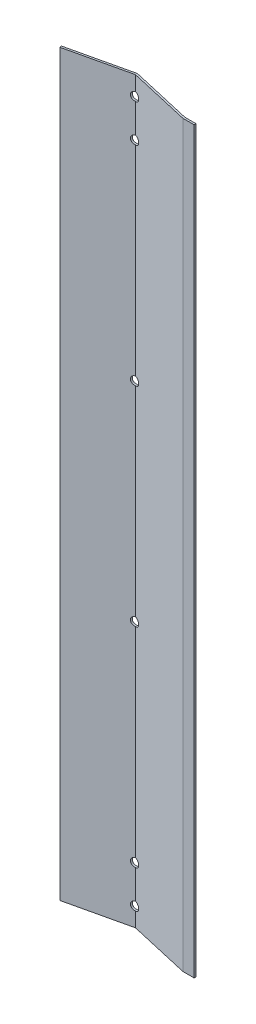
ISO-10303-21;
HEADER;
FILE_DESCRIPTION(('STEP AP214'),'2;1');
FILE_NAME('part.step','',(''),(''),'','','');
FILE_SCHEMA(('AUTOMOTIVE_DESIGN { 1 0 10303 214 1 1 1 1 }'));
ENDSEC;
DATA;
#1=APPLICATION_CONTEXT('core data for automotive mechanical design processes');
#2=APPLICATION_PROTOCOL_DEFINITION('international standard','automotive_design',2000,#1);
#3=PRODUCT_CONTEXT('',#1,'mechanical');
#4=PRODUCT('Part','Part','',(#3));
#5=PRODUCT_RELATED_PRODUCT_CATEGORY('part','',(#4));
#6=PRODUCT_DEFINITION_FORMATION('','',#4);
#7=PRODUCT_DEFINITION_CONTEXT('part definition',#1,'design');
#8=PRODUCT_DEFINITION('design','',#6,#7);
#9=PRODUCT_DEFINITION_SHAPE('','',#8);
#10=(LENGTH_UNIT() NAMED_UNIT(*) SI_UNIT(.MILLI.,.METRE.));
#11=(NAMED_UNIT(*) PLANE_ANGLE_UNIT() SI_UNIT($,.RADIAN.));
#12=(NAMED_UNIT(*) SI_UNIT($,.STERADIAN.) SOLID_ANGLE_UNIT());
#13=UNCERTAINTY_MEASURE_WITH_UNIT(LENGTH_MEASURE(1.E-05),#10,'distance_accuracy_value','');
#14=(GEOMETRIC_REPRESENTATION_CONTEXT(3) GLOBAL_UNCERTAINTY_ASSIGNED_CONTEXT((#13)) GLOBAL_UNIT_ASSIGNED_CONTEXT((#10,
#11,#12)) REPRESENTATION_CONTEXT('',''));
#15=CARTESIAN_POINT('',(0.,0.,0.));
#16=DIRECTION('',(0.,0.,1.));
#17=DIRECTION('',(1.,0.,0.));
#18=AXIS2_PLACEMENT_3D('',#15,#16,#17);
#19=CARTESIAN_POINT('',(-506.627585226793,1960.,994.704780496736));
#20=DIRECTION('',(-1.,0.,0.));
#21=DIRECTION('',(0.,0.,1.));
#22=AXIS2_PLACEMENT_3D('',#19,#20,#21);
#23=PLANE('',#22);
#24=DIRECTION('',(0.,0.,-1.));
#25=VECTOR('',#24,1.);
#26=CARTESIAN_POINT('',(-506.627585226793,0.,994.704780496736));
#27=LINE('',#26,#25);
#28=CARTESIAN_POINT('',(-506.627585226793,0.,999.704780496736));
#29=VERTEX_POINT('',#28);
#30=CARTESIAN_POINT('',(-506.627585226793,0.,994.704780496736));
#31=VERTEX_POINT('',#30);
#32=EDGE_CURVE('E269',#29,#31,#27,.T.);
#33=ORIENTED_EDGE('',*,*,#32,.T.);
#34=DIRECTION('',(0.,-1.,0.));
#35=VECTOR('',#34,1.);
#36=CARTESIAN_POINT('',(-506.627585226793,1960.,994.704780496736));
#37=LINE('',#36,#35);
#38=CARTESIAN_POINT('',(-506.627585226793,1960.,994.704780496736));
#39=VERTEX_POINT('',#38);
#40=EDGE_CURVE('E177',#39,#31,#37,.T.);
#41=ORIENTED_EDGE('',*,*,#40,.F.);
#42=DIRECTION('',(0.,0.,-1.));
#43=VECTOR('',#42,1.);
#44=CARTESIAN_POINT('',(-506.627585226793,1960.,994.704780496736));
#45=LINE('',#44,#43);
#46=CARTESIAN_POINT('',(-506.627585226793,1960.,999.704780496736));
#47=VERTEX_POINT('',#46);
#48=EDGE_CURVE('E270',#47,#39,#45,.T.);
#49=ORIENTED_EDGE('',*,*,#48,.F.);
#50=DIRECTION('',(0.,-1.,0.));
#51=VECTOR('',#50,1.);
#52=CARTESIAN_POINT('',(-506.627585226793,1960.,999.704780496736));
#53=LINE('',#52,#51);
#54=EDGE_CURVE('E288',#47,#29,#53,.T.);
#55=ORIENTED_EDGE('',*,*,#54,.T.);
#56=EDGE_LOOP('',(#33,#41,#49,#55));
#57=FACE_BOUND('',#56,.T.);
#58=ADVANCED_FACE('F33',(#57),#23,.F.);
#59=CARTESIAN_POINT('',(-536.087738825627,1960.,994.704780496736));
#60=DIRECTION('',(0.,0.,1.));
#61=DIRECTION('',(1.,0.,0.));
#62=AXIS2_PLACEMENT_3D('',#59,#60,#61);
#63=PLANE('',#62);
#64=DIRECTION('',(-1.,0.,0.));
#65=VECTOR('',#64,1.);
#66=CARTESIAN_POINT('',(-536.087738825627,0.,994.704780496736));
#67=LINE('',#66,#65);
#68=CARTESIAN_POINT('',(-536.087738825627,0.,994.704780496736));
#69=VERTEX_POINT('',#68);
#70=EDGE_CURVE('E291',#31,#69,#67,.T.);
#71=ORIENTED_EDGE('',*,*,#70,.T.);
#72=DIRECTION('',(0.,-1.,0.));
#73=VECTOR('',#72,1.);
#74=CARTESIAN_POINT('',(-536.087738825627,1960.,994.704780496736));
#75=LINE('',#74,#73);
#76=CARTESIAN_POINT('',(-536.087738825627,1960.,994.704780496736));
#77=VERTEX_POINT('',#76);
#78=EDGE_CURVE('E214',#77,#69,#75,.T.);
#79=ORIENTED_EDGE('',*,*,#78,.F.);
#80=DIRECTION('',(-1.,0.,0.));
#81=VECTOR('',#80,1.);
#82=CARTESIAN_POINT('',(-536.087738825627,1960.,994.704780496736));
#83=LINE('',#82,#81);
#84=EDGE_CURVE('E273',#39,#77,#83,.T.);
#85=ORIENTED_EDGE('',*,*,#84,.F.);
#86=ORIENTED_EDGE('',*,*,#40,.T.);
#87=EDGE_LOOP('',(#71,#79,#85,#86));
#88=FACE_BOUND('',#87,.T.);
#89=ADVANCED_FACE('F329',(#88),#63,.F.);
#90=CARTESIAN_POINT('',(-699.627585226793,1960.,957.225806909489));
#91=DIRECTION('',(-0.223382340793169,0.,0.974730901234676));
#92=DIRECTION('',(0.974730901234677,0.,0.223382340793169));
#93=AXIS2_PLACEMENT_3D('',#90,#91,#92);
#94=PLANE('',#93);
#95=CARTESIAN_POINT('',(-699.627585226793,50.,957.225806909489));
#96=DIRECTION('',(-0.223382340793169,0.,0.974730901234676));
#97=DIRECTION('',(-0.974730901234677,0.,-0.223382340793169));
#98=AXIS2_PLACEMENT_3D('',#95,#96,#97);
#99=ELLIPSE('',#98,11.2851659735692,11.);
#100=CARTESIAN_POINT('',(-699.627585226793,61.0000000000006,957.225806909489));
#101=VERTEX_POINT('',#100);
#102=CARTESIAN_POINT('',(-699.627585226793,39.0000000000004,957.225806909489));
#103=VERTEX_POINT('',#102);
#104=EDGE_CURVE('E46',#101,#103,#99,.F.);
#105=ORIENTED_EDGE('',*,*,#104,.F.);
#106=DIRECTION('',(0.,-1.,0.));
#107=VECTOR('',#106,1.);
#108=CARTESIAN_POINT('',(-699.627585226793,1960.,957.225806909489));
#109=LINE('',#108,#107);
#110=CARTESIAN_POINT('',(-699.627585226793,139.,957.225806909489));
#111=VERTEX_POINT('',#110);
#112=EDGE_CURVE('E376',#111,#101,#109,.T.);
#113=ORIENTED_EDGE('',*,*,#112,.F.);
#114=CARTESIAN_POINT('',(-699.627585226793,150.,957.225806909489));
#115=DIRECTION('',(-0.223382340793169,0.,0.974730901234676));
#116=DIRECTION('',(-0.974730901234677,0.,-0.223382340793169));
#117=AXIS2_PLACEMENT_3D('',#114,#115,#116);
#118=ELLIPSE('',#117,11.2851659735692,11.);
#119=CARTESIAN_POINT('',(-699.627585226793,161.,957.225806909489));
#120=VERTEX_POINT('',#119);
#121=EDGE_CURVE('E53',#120,#111,#118,.F.);
#122=ORIENTED_EDGE('',*,*,#121,.F.);
#123=CARTESIAN_POINT('',(-699.627585226793,692.33,957.225806909489));
#124=VERTEX_POINT('',#123);
#125=EDGE_CURVE('E378',#124,#120,#109,.T.);
#126=ORIENTED_EDGE('',*,*,#125,.F.);
#127=CARTESIAN_POINT('',(-699.627585226793,703.33,957.225806909489));
#128=DIRECTION('',(-0.223382340793169,0.,0.974730901234676));
#129=DIRECTION('',(-0.974730901234677,0.,-0.223382340793169));
#130=AXIS2_PLACEMENT_3D('',#127,#128,#129);
#131=ELLIPSE('',#130,11.2851659735692,11.);
#132=CARTESIAN_POINT('',(-699.627585226793,714.33,957.225806909489));
#133=VERTEX_POINT('',#132);
#134=EDGE_CURVE('E242',#133,#124,#131,.F.);
#135=ORIENTED_EDGE('',*,*,#134,.F.);
#136=CARTESIAN_POINT('',(-699.627585226793,1245.66,957.225806909489));
#137=VERTEX_POINT('',#136);
#138=EDGE_CURVE('E379',#137,#133,#109,.T.);
#139=ORIENTED_EDGE('',*,*,#138,.F.);
#140=CARTESIAN_POINT('',(-699.627585226793,1256.66,957.225806909489));
#141=DIRECTION('',(-0.223382340793169,0.,0.974730901234676));
#142=DIRECTION('',(-0.974730901234677,0.,-0.223382340793169));
#143=AXIS2_PLACEMENT_3D('',#140,#141,#142);
#144=ELLIPSE('',#143,11.2851659735692,11.);
#145=CARTESIAN_POINT('',(-699.627585226793,1267.66,957.225806909489));
#146=VERTEX_POINT('',#145);
#147=EDGE_CURVE('E262',#146,#137,#144,.F.);
#148=ORIENTED_EDGE('',*,*,#147,.F.);
#149=CARTESIAN_POINT('',(-699.627585226793,1799.,957.225806909489));
#150=VERTEX_POINT('',#149);
#151=EDGE_CURVE('E495',#150,#146,#109,.T.);
#152=ORIENTED_EDGE('',*,*,#151,.F.);
#153=CARTESIAN_POINT('',(-699.627585226793,1810.,957.225806909489));
#154=DIRECTION('',(-0.223382340793169,0.,0.974730901234676));
#155=DIRECTION('',(-0.974730901234677,0.,-0.223382340793169));
#156=AXIS2_PLACEMENT_3D('',#153,#154,#155);
#157=ELLIPSE('',#156,11.2851659735692,11.);
#158=CARTESIAN_POINT('',(-699.627585226793,1821.,957.225806909489));
#159=VERTEX_POINT('',#158);
#160=EDGE_CURVE('E244',#159,#150,#157,.F.);
#161=ORIENTED_EDGE('',*,*,#160,.F.);
#162=CARTESIAN_POINT('',(-699.627585226793,1899.,957.225806909489));
#163=VERTEX_POINT('',#162);
#164=EDGE_CURVE('E215',#163,#159,#109,.T.);
#165=ORIENTED_EDGE('',*,*,#164,.F.);
#166=CARTESIAN_POINT('',(-699.627585226793,1910.,957.225806909489));
#167=DIRECTION('',(-0.223382340793169,0.,0.974730901234676));
#168=DIRECTION('',(-0.974730901234677,0.,-0.223382340793169));
#169=AXIS2_PLACEMENT_3D('',#166,#167,#168);
#170=ELLIPSE('',#169,11.2851659735692,11.);
#171=CARTESIAN_POINT('',(-699.627585226793,1921.,957.225806909489));
#172=VERTEX_POINT('',#171);
#173=EDGE_CURVE('E254',#172,#163,#170,.F.);
#174=ORIENTED_EDGE('',*,*,#173,.F.);
#175=CARTESIAN_POINT('',(-699.627585226793,1960.,957.225806909489));
#176=VERTEX_POINT('',#175);
#177=EDGE_CURVE('E211',#176,#172,#109,.T.);
#178=ORIENTED_EDGE('',*,*,#177,.F.);
#179=DIRECTION('',(-0.974730901234676,0.,-0.223382340793169));
#180=VECTOR('',#179,1.);
#181=CARTESIAN_POINT('',(-699.627585226793,1960.,957.225806909489));
#182=LINE('',#181,#180);
#183=EDGE_CURVE('E276',#77,#176,#182,.T.);
#184=ORIENTED_EDGE('',*,*,#183,.F.);
#185=ORIENTED_EDGE('',*,*,#78,.T.);
#186=DIRECTION('',(-0.974730901234676,0.,-0.223382340793169));
#187=VECTOR('',#186,1.);
#188=CARTESIAN_POINT('',(-699.627585226793,0.,957.225806909489));
#189=LINE('',#188,#187);
#190=CARTESIAN_POINT('',(-699.627585226793,0.,957.225806909489));
#191=VERTEX_POINT('',#190);
#192=EDGE_CURVE('E293',#69,#191,#189,.T.);
#193=ORIENTED_EDGE('',*,*,#192,.T.);
#194=EDGE_CURVE('E210',#103,#191,#109,.T.);
#195=ORIENTED_EDGE('',*,*,#194,.F.);
#196=EDGE_LOOP('',(#105,#113,#122,#126,#135,#139,#148,#152,#161,#165,#174,#178,#184,#185,#193,#195));
#197=FACE_BOUND('',#196,.T.);
#198=ADVANCED_FACE('F333',(#197),#94,.F.);
#199=CARTESIAN_POINT('',(-863.694836688782,1960.,994.820010868915));
#200=DIRECTION('',(0.223350522964437,0.,0.974738192486328));
#201=DIRECTION('',(0.974738192486328,0.,-0.223350522964437));
#202=AXIS2_PLACEMENT_3D('',#199,#200,#201);
#203=PLANE('',#202);
#204=CARTESIAN_POINT('',(-699.627585226793,50.,957.225806909489));
#205=DIRECTION('',(0.223350522964437,0.,0.974738192486328));
#206=DIRECTION('',(0.974738192486328,0.,-0.223350522964437));
#207=AXIS2_PLACEMENT_3D('',#204,#205,#206);
#208=ELLIPSE('',#207,11.2850815580968,11.);
#209=EDGE_CURVE('E266',#103,#101,#208,.F.);
#210=ORIENTED_EDGE('',*,*,#209,.F.);
#211=ORIENTED_EDGE('',*,*,#194,.T.);
#212=DIRECTION('',(-0.974738192486327,0.,0.223350522964437));
#213=VECTOR('',#212,1.);
#214=CARTESIAN_POINT('',(-863.694836688782,0.,994.820010868915));
#215=LINE('',#214,#213);
#216=CARTESIAN_POINT('',(-863.694836688782,0.,994.820010868915));
#217=VERTEX_POINT('',#216);
#218=EDGE_CURVE('E296',#191,#217,#215,.T.);
#219=ORIENTED_EDGE('',*,*,#218,.T.);
#220=DIRECTION('',(0.,-1.,0.));
#221=VECTOR('',#220,1.);
#222=CARTESIAN_POINT('',(-863.694836688782,1960.,994.820010868915));
#223=LINE('',#222,#221);
#224=CARTESIAN_POINT('',(-863.694836688782,1960.,994.820010868915));
#225=VERTEX_POINT('',#224);
#226=EDGE_CURVE('E207',#225,#217,#223,.T.);
#227=ORIENTED_EDGE('',*,*,#226,.F.);
#228=DIRECTION('',(-0.974738192486327,0.,0.223350522964437));
#229=VECTOR('',#228,1.);
#230=CARTESIAN_POINT('',(-863.694836688782,1960.,994.820010868915));
#231=LINE('',#230,#229);
#232=EDGE_CURVE('E278',#176,#225,#231,.T.);
#233=ORIENTED_EDGE('',*,*,#232,.F.);
#234=ORIENTED_EDGE('',*,*,#177,.T.);
#235=CARTESIAN_POINT('',(-699.627585226793,1910.,957.225806909489));
#236=DIRECTION('',(0.223350522964437,0.,0.974738192486328));
#237=DIRECTION('',(0.974738192486328,0.,-0.223350522964437));
#238=AXIS2_PLACEMENT_3D('',#235,#236,#237);
#239=ELLIPSE('',#238,11.2850815580968,11.);
#240=EDGE_CURVE('E252',#163,#172,#239,.F.);
#241=ORIENTED_EDGE('',*,*,#240,.F.);
#242=ORIENTED_EDGE('',*,*,#164,.T.);
#243=CARTESIAN_POINT('',(-699.627585226793,1810.,957.225806909489));
#244=DIRECTION('',(0.223350522964437,0.,0.974738192486328));
#245=DIRECTION('',(0.974738192486328,0.,-0.223350522964437));
#246=AXIS2_PLACEMENT_3D('',#243,#244,#245);
#247=ELLIPSE('',#246,11.2850815580968,11.);
#248=EDGE_CURVE('E241',#150,#159,#247,.F.);
#249=ORIENTED_EDGE('',*,*,#248,.F.);
#250=ORIENTED_EDGE('',*,*,#151,.T.);
#251=CARTESIAN_POINT('',(-699.627585226793,1256.66,957.225806909489));
#252=DIRECTION('',(0.223350522964437,0.,0.974738192486328));
#253=DIRECTION('',(0.974738192486328,0.,-0.223350522964437));
#254=AXIS2_PLACEMENT_3D('',#251,#252,#253);
#255=ELLIPSE('',#254,11.2850815580968,11.);
#256=EDGE_CURVE('E230',#137,#146,#255,.F.);
#257=ORIENTED_EDGE('',*,*,#256,.F.);
#258=ORIENTED_EDGE('',*,*,#138,.T.);
#259=CARTESIAN_POINT('',(-699.627585226793,703.33,957.225806909489));
#260=DIRECTION('',(0.223350522964437,0.,0.974738192486328));
#261=DIRECTION('',(0.974738192486328,0.,-0.223350522964437));
#262=AXIS2_PLACEMENT_3D('',#259,#260,#261);
#263=ELLIPSE('',#262,11.2850815580968,11.);
#264=EDGE_CURVE('E187',#124,#133,#263,.F.);
#265=ORIENTED_EDGE('',*,*,#264,.F.);
#266=ORIENTED_EDGE('',*,*,#125,.T.);
#267=CARTESIAN_POINT('',(-699.627585226793,150.,957.225806909489));
#268=DIRECTION('',(0.223350522964437,0.,0.974738192486328));
#269=DIRECTION('',(0.974738192486328,0.,-0.223350522964437));
#270=AXIS2_PLACEMENT_3D('',#267,#268,#269);
#271=ELLIPSE('',#270,11.2850815580968,11.);
#272=EDGE_CURVE('E258',#111,#120,#271,.F.);
#273=ORIENTED_EDGE('',*,*,#272,.F.);
#274=ORIENTED_EDGE('',*,*,#112,.T.);
#275=EDGE_LOOP('',(#210,#211,#219,#227,#233,#234,#241,#242,#249,#250,#257,#258,#265,#266,#273,#274));
#276=FACE_BOUND('',#275,.T.);
#277=ADVANCED_FACE('F363',(#276),#203,.F.);
#278=CARTESIAN_POINT('',(-862.627585226793,1960.,999.704780496736));
#279=DIRECTION('',(0.976953925564228,0.,-0.213450292397655));
#280=DIRECTION('',(-0.213450292397655,0.,-0.976953925564228));
#281=AXIS2_PLACEMENT_3D('',#278,#279,#280);
#282=PLANE('',#281);
#283=DIRECTION('',(0.213450292397655,0.,0.976953925564228));
#284=VECTOR('',#283,1.);
#285=CARTESIAN_POINT('',(-862.627585226793,0.,999.704780496736));
#286=LINE('',#285,#284);
#287=CARTESIAN_POINT('',(-862.627585226793,0.,999.704780496736));
#288=VERTEX_POINT('',#287);
#289=EDGE_CURVE('E298',#217,#288,#286,.T.);
#290=ORIENTED_EDGE('',*,*,#289,.T.);
#291=DIRECTION('',(0.,-1.,0.));
#292=VECTOR('',#291,1.);
#293=CARTESIAN_POINT('',(-862.627585226793,1960.,999.704780496736));
#294=LINE('',#293,#292);
#295=CARTESIAN_POINT('',(-862.627585226793,1960.,999.704780496736));
#296=VERTEX_POINT('',#295);
#297=EDGE_CURVE('E201',#296,#288,#294,.T.);
#298=ORIENTED_EDGE('',*,*,#297,.F.);
#299=DIRECTION('',(0.213450292397655,0.,0.976953925564228));
#300=VECTOR('',#299,1.);
#301=CARTESIAN_POINT('',(-862.627585226793,1960.,999.704780496736));
#302=LINE('',#301,#300);
#303=EDGE_CURVE('E280',#225,#296,#302,.T.);
#304=ORIENTED_EDGE('',*,*,#303,.F.);
#305=ORIENTED_EDGE('',*,*,#226,.T.);
#306=EDGE_LOOP('',(#290,#298,#304,#305));
#307=FACE_BOUND('',#306,.T.);
#308=ADVANCED_FACE('F360',(#307),#282,.F.);
#309=CARTESIAN_POINT('',(-699.627585226793,1960.,962.343755534459));
#310=DIRECTION('',(-0.223415121692305,0.,-0.974723388146202));
#311=DIRECTION('',(-0.974723388146203,0.,0.223415121692305));
#312=AXIS2_PLACEMENT_3D('',#309,#310,#311);
#313=PLANE('',#312);
#314=CARTESIAN_POINT('',(-699.627585226793,50.,962.343755534459));
#315=DIRECTION('',(-0.223415121692305,0.,-0.974723388146202));
#316=DIRECTION('',(0.974723388146202,0.,-0.223415121692305));
#317=AXIS2_PLACEMENT_3D('',#314,#315,#316);
#318=ELLIPSE('',#317,11.2852529587093,11.);
#319=CARTESIAN_POINT('',(-699.627585226793,61.0000000000002,962.343755534459));
#320=VERTEX_POINT('',#319);
#321=CARTESIAN_POINT('',(-699.627585226793,38.9999999999999,962.343755534459));
#322=VERTEX_POINT('',#321);
#323=EDGE_CURVE('E264',#320,#322,#318,.F.);
#324=ORIENTED_EDGE('',*,*,#323,.F.);
#325=DIRECTION('',(0.,-1.,0.));
#326=VECTOR('',#325,1.);
#327=CARTESIAN_POINT('',(-699.627585226793,1960.,962.343755534459));
#328=LINE('',#327,#326);
#329=CARTESIAN_POINT('',(-699.627585226793,139.,962.343755534459));
#330=VERTEX_POINT('',#329);
#331=EDGE_CURVE('E196',#330,#320,#328,.T.);
#332=ORIENTED_EDGE('',*,*,#331,.F.);
#333=CARTESIAN_POINT('',(-699.627585226793,150.,962.343755534459));
#334=DIRECTION('',(-0.223415121692305,0.,-0.974723388146202));
#335=DIRECTION('',(0.974723388146202,0.,-0.223415121692305));
#336=AXIS2_PLACEMENT_3D('',#333,#334,#335);
#337=ELLIPSE('',#336,11.2852529587093,11.);
#338=CARTESIAN_POINT('',(-699.627585226793,161.,962.343755534459));
#339=VERTEX_POINT('',#338);
#340=EDGE_CURVE('E256',#339,#330,#337,.F.);
#341=ORIENTED_EDGE('',*,*,#340,.F.);
#342=CARTESIAN_POINT('',(-699.627585226793,692.33,962.343755534459));
#343=VERTEX_POINT('',#342);
#344=EDGE_CURVE('E186',#343,#339,#328,.T.);
#345=ORIENTED_EDGE('',*,*,#344,.F.);
#346=CARTESIAN_POINT('',(-699.627585226793,703.33,962.343755534459));
#347=DIRECTION('',(-0.223415121692305,0.,-0.974723388146202));
#348=DIRECTION('',(0.974723388146202,0.,-0.223415121692305));
#349=AXIS2_PLACEMENT_3D('',#346,#347,#348);
#350=ELLIPSE('',#349,11.2852529587093,11.);
#351=CARTESIAN_POINT('',(-699.627585226793,714.33,962.343755534459));
#352=VERTEX_POINT('',#351);
#353=EDGE_CURVE('E171',#352,#343,#350,.F.);
#354=ORIENTED_EDGE('',*,*,#353,.F.);
#355=CARTESIAN_POINT('',(-699.627585226793,1245.66,962.343755534459));
#356=VERTEX_POINT('',#355);
#357=EDGE_CURVE('E184',#356,#352,#328,.T.);
#358=ORIENTED_EDGE('',*,*,#357,.F.);
#359=CARTESIAN_POINT('',(-699.627585226793,1256.66,962.343755534459));
#360=DIRECTION('',(-0.223415121692305,0.,-0.974723388146202));
#361=DIRECTION('',(0.974723388146202,0.,-0.223415121692305));
#362=AXIS2_PLACEMENT_3D('',#359,#360,#361);
#363=ELLIPSE('',#362,11.2852529587093,11.);
#364=CARTESIAN_POINT('',(-699.627585226793,1267.66,962.343755534459));
#365=VERTEX_POINT('',#364);
#366=EDGE_CURVE('E227',#365,#356,#363,.F.);
#367=ORIENTED_EDGE('',*,*,#366,.F.);
#368=CARTESIAN_POINT('',(-699.627585226793,1799.,962.343755534459));
#369=VERTEX_POINT('',#368);
#370=EDGE_CURVE('E193',#369,#365,#328,.T.);
#371=ORIENTED_EDGE('',*,*,#370,.F.);
#372=CARTESIAN_POINT('',(-699.627585226793,1810.,962.343755534459));
#373=DIRECTION('',(-0.223415121692305,0.,-0.974723388146202));
#374=DIRECTION('',(0.974723388146202,0.,-0.223415121692305));
#375=AXIS2_PLACEMENT_3D('',#372,#373,#374);
#376=ELLIPSE('',#375,11.2852529587093,11.);
#377=CARTESIAN_POINT('',(-699.627585226793,1821.,962.343755534459));
#378=VERTEX_POINT('',#377);
#379=EDGE_CURVE('E239',#378,#369,#376,.F.);
#380=ORIENTED_EDGE('',*,*,#379,.F.);
#381=CARTESIAN_POINT('',(-699.627585226793,1899.,962.343755534459));
#382=VERTEX_POINT('',#381);
#383=EDGE_CURVE('E195',#382,#378,#328,.T.);
#384=ORIENTED_EDGE('',*,*,#383,.F.);
#385=CARTESIAN_POINT('',(-699.627585226793,1910.,962.343755534459));
#386=DIRECTION('',(-0.223415121692305,0.,-0.974723388146202));
#387=DIRECTION('',(0.974723388146202,0.,-0.223415121692305));
#388=AXIS2_PLACEMENT_3D('',#385,#386,#387);
#389=ELLIPSE('',#388,11.2852529587093,11.);
#390=CARTESIAN_POINT('',(-699.627585226793,1921.,962.343755534459));
#391=VERTEX_POINT('',#390);
#392=EDGE_CURVE('E250',#391,#382,#389,.F.);
#393=ORIENTED_EDGE('',*,*,#392,.F.);
#394=CARTESIAN_POINT('',(-699.627585226793,1960.,962.343755534459));
#395=VERTEX_POINT('',#394);
#396=EDGE_CURVE('E197',#395,#391,#328,.T.);
#397=ORIENTED_EDGE('',*,*,#396,.F.);
#398=DIRECTION('',(0.974723388146203,0.,-0.223415121692305));
#399=VECTOR('',#398,1.);
#400=CARTESIAN_POINT('',(-699.627585226793,1960.,962.343755534459));
#401=LINE('',#400,#399);
#402=EDGE_CURVE('E282',#296,#395,#401,.T.);
#403=ORIENTED_EDGE('',*,*,#402,.F.);
#404=ORIENTED_EDGE('',*,*,#297,.T.);
#405=DIRECTION('',(0.974723388146203,0.,-0.223415121692305));
#406=VECTOR('',#405,1.);
#407=CARTESIAN_POINT('',(-699.627585226793,0.,962.343755534459));
#408=LINE('',#407,#406);
#409=CARTESIAN_POINT('',(-699.627585226793,0.,962.343755534459));
#410=VERTEX_POINT('',#409);
#411=EDGE_CURVE('E300',#288,#410,#408,.T.);
#412=ORIENTED_EDGE('',*,*,#411,.T.);
#413=EDGE_CURVE('E202',#322,#410,#328,.T.);
#414=ORIENTED_EDGE('',*,*,#413,.F.);
#415=EDGE_LOOP('',(#324,#332,#341,#345,#354,#358,#367,#371,#380,#384,#393,#397,#403,#404,#412,#414));
#416=FACE_BOUND('',#415,.T.);
#417=ADVANCED_FACE('F182',(#416),#313,.F.);
#418=CARTESIAN_POINT('',(-536.627585226793,1960.,999.704780496736));
#419=DIRECTION('',(0.223415121692307,0.,-0.974723388146202));
#420=DIRECTION('',(-0.974723388146202,0.,-0.223415121692307));
#421=AXIS2_PLACEMENT_3D('',#418,#419,#420);
#422=PLANE('',#421);
#423=CARTESIAN_POINT('',(-699.627585226793,50.,962.343755534459));
#424=DIRECTION('',(0.223415121692307,0.,-0.974723388146202));
#425=DIRECTION('',(-0.974723388146202,0.,-0.223415121692307));
#426=AXIS2_PLACEMENT_3D('',#423,#424,#425);
#427=ELLIPSE('',#426,11.2852529587093,11.);
#428=EDGE_CURVE('E11',#322,#320,#427,.F.);
#429=ORIENTED_EDGE('',*,*,#428,.F.);
#430=ORIENTED_EDGE('',*,*,#413,.T.);
#431=DIRECTION('',(0.974723388146202,0.,0.223415121692307));
#432=VECTOR('',#431,1.);
#433=CARTESIAN_POINT('',(-536.627585226793,0.,999.704780496736));
#434=LINE('',#433,#432);
#435=CARTESIAN_POINT('',(-536.627585226793,0.,999.704780496736));
#436=VERTEX_POINT('',#435);
#437=EDGE_CURVE('E303',#410,#436,#434,.T.);
#438=ORIENTED_EDGE('',*,*,#437,.T.);
#439=DIRECTION('',(0.,-1.,0.));
#440=VECTOR('',#439,1.);
#441=CARTESIAN_POINT('',(-536.627585226793,1960.,999.704780496736));
#442=LINE('',#441,#440);
#443=CARTESIAN_POINT('',(-536.627585226793,1960.,999.704780496736));
#444=VERTEX_POINT('',#443);
#445=EDGE_CURVE('E203',#444,#436,#442,.T.);
#446=ORIENTED_EDGE('',*,*,#445,.F.);
#447=DIRECTION('',(0.974723388146202,0.,0.223415121692307));
#448=VECTOR('',#447,1.);
#449=CARTESIAN_POINT('',(-536.627585226793,1960.,999.704780496736));
#450=LINE('',#449,#448);
#451=EDGE_CURVE('E284',#395,#444,#450,.T.);
#452=ORIENTED_EDGE('',*,*,#451,.F.);
#453=ORIENTED_EDGE('',*,*,#396,.T.);
#454=CARTESIAN_POINT('',(-699.627585226793,1910.,962.343755534459));
#455=DIRECTION('',(0.223415121692307,0.,-0.974723388146202));
#456=DIRECTION('',(-0.974723388146202,0.,-0.223415121692307));
#457=AXIS2_PLACEMENT_3D('',#454,#455,#456);
#458=ELLIPSE('',#457,11.2852529587093,11.);
#459=EDGE_CURVE('E221',#382,#391,#458,.F.);
#460=ORIENTED_EDGE('',*,*,#459,.F.);
#461=ORIENTED_EDGE('',*,*,#383,.T.);
#462=CARTESIAN_POINT('',(-699.627585226793,1810.,962.343755534459));
#463=DIRECTION('',(0.223415121692307,0.,-0.974723388146202));
#464=DIRECTION('',(-0.974723388146202,0.,-0.223415121692307));
#465=AXIS2_PLACEMENT_3D('',#462,#463,#464);
#466=ELLIPSE('',#465,11.2852529587093,11.);
#467=EDGE_CURVE('E176',#369,#378,#466,.F.);
#468=ORIENTED_EDGE('',*,*,#467,.F.);
#469=ORIENTED_EDGE('',*,*,#370,.T.);
#470=CARTESIAN_POINT('',(-699.627585226793,1256.66,962.343755534459));
#471=DIRECTION('',(0.223415121692307,0.,-0.974723388146202));
#472=DIRECTION('',(-0.974723388146202,0.,-0.223415121692307));
#473=AXIS2_PLACEMENT_3D('',#470,#471,#472);
#474=ELLIPSE('',#473,11.2852529587093,11.);
#475=EDGE_CURVE('E40',#356,#365,#474,.F.);
#476=ORIENTED_EDGE('',*,*,#475,.F.);
#477=ORIENTED_EDGE('',*,*,#357,.T.);
#478=CARTESIAN_POINT('',(-699.627585226793,703.33,962.343755534459));
#479=DIRECTION('',(0.223415121692307,0.,-0.974723388146202));
#480=DIRECTION('',(-0.974723388146202,0.,-0.223415121692307));
#481=AXIS2_PLACEMENT_3D('',#478,#479,#480);
#482=ELLIPSE('',#481,11.2852529587093,11.);
#483=EDGE_CURVE('E167',#343,#352,#482,.F.);
#484=ORIENTED_EDGE('',*,*,#483,.F.);
#485=ORIENTED_EDGE('',*,*,#344,.T.);
#486=CARTESIAN_POINT('',(-699.627585226793,150.,962.343755534459));
#487=DIRECTION('',(0.223415121692307,0.,-0.974723388146202));
#488=DIRECTION('',(-0.974723388146202,0.,-0.223415121692307));
#489=AXIS2_PLACEMENT_3D('',#486,#487,#488);
#490=ELLIPSE('',#489,11.2852529587093,11.);
#491=EDGE_CURVE('E223',#330,#339,#490,.F.);
#492=ORIENTED_EDGE('',*,*,#491,.F.);
#493=ORIENTED_EDGE('',*,*,#331,.T.);
#494=EDGE_LOOP('',(#429,#430,#438,#446,#452,#453,#460,#461,#468,#469,#476,#477,#484,#485,#492,#493));
#495=FACE_BOUND('',#494,.T.);
#496=ADVANCED_FACE('F191',(#495),#422,.F.);
#497=CARTESIAN_POINT('',(-506.627585226793,1960.,999.704780496736));
#498=DIRECTION('',(0.,0.,-1.));
#499=DIRECTION('',(-1.,0.,0.));
#500=AXIS2_PLACEMENT_3D('',#497,#498,#499);
#501=PLANE('',#500);
#502=DIRECTION('',(1.,0.,0.));
#503=VECTOR('',#502,1.);
#504=CARTESIAN_POINT('',(-506.627585226793,0.,999.704780496736));
#505=LINE('',#504,#503);
#506=EDGE_CURVE('E274',#436,#29,#505,.T.);
#507=ORIENTED_EDGE('',*,*,#506,.T.);
#508=ORIENTED_EDGE('',*,*,#54,.F.);
#509=DIRECTION('',(1.,0.,0.));
#510=VECTOR('',#509,1.);
#511=CARTESIAN_POINT('',(-506.627585226793,1960.,999.704780496736));
#512=LINE('',#511,#510);
#513=EDGE_CURVE('E286',#444,#47,#512,.T.);
#514=ORIENTED_EDGE('',*,*,#513,.F.);
#515=ORIENTED_EDGE('',*,*,#445,.T.);
#516=EDGE_LOOP('',(#507,#508,#514,#515));
#517=FACE_BOUND('',#516,.T.);
#518=ADVANCED_FACE('F346',(#517),#501,.F.);
#519=CARTESIAN_POINT('',(0.,1960.,0.));
#520=DIRECTION('',(0.,-1.,0.));
#521=DIRECTION('',(0.,0.,-1.));
#522=AXIS2_PLACEMENT_3D('',#519,#520,#521);
#523=PLANE('',#522);
#524=ORIENTED_EDGE('',*,*,#48,.T.);
#525=ORIENTED_EDGE('',*,*,#84,.T.);
#526=ORIENTED_EDGE('',*,*,#183,.T.);
#527=ORIENTED_EDGE('',*,*,#232,.T.);
#528=ORIENTED_EDGE('',*,*,#303,.T.);
#529=ORIENTED_EDGE('',*,*,#402,.T.);
#530=ORIENTED_EDGE('',*,*,#451,.T.);
#531=ORIENTED_EDGE('',*,*,#513,.T.);
#532=EDGE_LOOP('',(#524,#525,#526,#527,#528,#529,#530,#531));
#533=FACE_BOUND('',#532,.T.);
#534=ADVANCED_FACE('F344',(#533),#523,.F.);
#535=CARTESIAN_POINT('',(0.,0.,0.));
#536=DIRECTION('',(0.,-1.,0.));
#537=DIRECTION('',(0.,0.,-1.));
#538=AXIS2_PLACEMENT_3D('',#535,#536,#537);
#539=PLANE('',#538);
#540=ORIENTED_EDGE('',*,*,#32,.F.);
#541=ORIENTED_EDGE('',*,*,#506,.F.);
#542=ORIENTED_EDGE('',*,*,#437,.F.);
#543=ORIENTED_EDGE('',*,*,#411,.F.);
#544=ORIENTED_EDGE('',*,*,#289,.F.);
#545=ORIENTED_EDGE('',*,*,#218,.F.);
#546=ORIENTED_EDGE('',*,*,#192,.F.);
#547=ORIENTED_EDGE('',*,*,#70,.F.);
#548=EDGE_LOOP('',(#540,#541,#542,#543,#544,#545,#546,#547));
#549=FACE_BOUND('',#548,.T.);
#550=ADVANCED_FACE('F337',(#549),#539,.T.);
#551=CARTESIAN_POINT('',(-699.627585226793,703.33,957.225806909489));
#552=DIRECTION('',(0.,0.,-1.));
#553=DIRECTION('',(-1.,0.,0.));
#554=AXIS2_PLACEMENT_3D('',#551,#552,#553);
#555=CYLINDRICAL_SURFACE('',#554,11.);
#556=ORIENTED_EDGE('',*,*,#353,.T.);
#557=ORIENTED_EDGE('',*,*,#483,.T.);
#558=EDGE_LOOP('',(#556,#557));
#559=FACE_BOUND('',#558,.T.);
#560=ORIENTED_EDGE('',*,*,#134,.T.);
#561=ORIENTED_EDGE('',*,*,#264,.T.);
#562=EDGE_LOOP('',(#560,#561));
#563=FACE_BOUND('',#562,.T.);
#564=ADVANCED_FACE('F169',(#559,#563),#555,.F.);
#565=CARTESIAN_POINT('',(-699.627585226793,1810.,957.225806909489));
#566=DIRECTION('',(0.,0.,-1.));
#567=DIRECTION('',(-1.,0.,0.));
#568=AXIS2_PLACEMENT_3D('',#565,#566,#567);
#569=CYLINDRICAL_SURFACE('',#568,11.);
#570=ORIENTED_EDGE('',*,*,#379,.T.);
#571=ORIENTED_EDGE('',*,*,#467,.T.);
#572=EDGE_LOOP('',(#570,#571));
#573=FACE_BOUND('',#572,.T.);
#574=ORIENTED_EDGE('',*,*,#160,.T.);
#575=ORIENTED_EDGE('',*,*,#248,.T.);
#576=EDGE_LOOP('',(#574,#575));
#577=FACE_BOUND('',#576,.T.);
#578=ADVANCED_FACE('F237',(#573,#577),#569,.F.);
#579=CARTESIAN_POINT('',(-699.627585226793,1910.,957.225806909489));
#580=DIRECTION('',(0.,0.,-1.));
#581=DIRECTION('',(-1.,0.,0.));
#582=AXIS2_PLACEMENT_3D('',#579,#580,#581);
#583=CYLINDRICAL_SURFACE('',#582,11.);
#584=ORIENTED_EDGE('',*,*,#392,.T.);
#585=ORIENTED_EDGE('',*,*,#459,.T.);
#586=EDGE_LOOP('',(#584,#585));
#587=FACE_BOUND('',#586,.T.);
#588=ORIENTED_EDGE('',*,*,#173,.T.);
#589=ORIENTED_EDGE('',*,*,#240,.T.);
#590=EDGE_LOOP('',(#588,#589));
#591=FACE_BOUND('',#590,.T.);
#592=ADVANCED_FACE('F395',(#587,#591),#583,.F.);
#593=CARTESIAN_POINT('',(-699.627585226793,150.,957.225806909489));
#594=DIRECTION('',(0.,0.,-1.));
#595=DIRECTION('',(-1.,0.,0.));
#596=AXIS2_PLACEMENT_3D('',#593,#594,#595);
#597=CYLINDRICAL_SURFACE('',#596,11.);
#598=ORIENTED_EDGE('',*,*,#340,.T.);
#599=ORIENTED_EDGE('',*,*,#491,.T.);
#600=EDGE_LOOP('',(#598,#599));
#601=FACE_BOUND('',#600,.T.);
#602=ORIENTED_EDGE('',*,*,#121,.T.);
#603=ORIENTED_EDGE('',*,*,#272,.T.);
#604=EDGE_LOOP('',(#602,#603));
#605=FACE_BOUND('',#604,.T.);
#606=ADVANCED_FACE('F326',(#601,#605),#597,.F.);
#607=CARTESIAN_POINT('',(-699.627585226793,1256.66,957.225806909489));
#608=DIRECTION('',(0.,0.,-1.));
#609=DIRECTION('',(-1.,0.,0.));
#610=AXIS2_PLACEMENT_3D('',#607,#608,#609);
#611=CYLINDRICAL_SURFACE('',#610,11.);
#612=ORIENTED_EDGE('',*,*,#366,.T.);
#613=ORIENTED_EDGE('',*,*,#475,.T.);
#614=EDGE_LOOP('',(#612,#613));
#615=FACE_BOUND('',#614,.T.);
#616=ORIENTED_EDGE('',*,*,#147,.T.);
#617=ORIENTED_EDGE('',*,*,#256,.T.);
#618=EDGE_LOOP('',(#616,#617));
#619=FACE_BOUND('',#618,.T.);
#620=ADVANCED_FACE('F225',(#615,#619),#611,.F.);
#621=CARTESIAN_POINT('',(-699.627585226793,50.,957.225806909489));
#622=DIRECTION('',(0.,0.,-1.));
#623=DIRECTION('',(-1.,0.,0.));
#624=AXIS2_PLACEMENT_3D('',#621,#622,#623);
#625=CYLINDRICAL_SURFACE('',#624,11.);
#626=ORIENTED_EDGE('',*,*,#323,.T.);
#627=ORIENTED_EDGE('',*,*,#428,.T.);
#628=EDGE_LOOP('',(#626,#627));
#629=FACE_BOUND('',#628,.T.);
#630=ORIENTED_EDGE('',*,*,#104,.T.);
#631=ORIENTED_EDGE('',*,*,#209,.T.);
#632=EDGE_LOOP('',(#630,#631));
#633=FACE_BOUND('',#632,.T.);
#634=ADVANCED_FACE('F320',(#629,#633),#625,.F.);
#635=CLOSED_SHELL('',(#58,#89,#198,#277,#308,#417,#496,#518,#534,#550,#564,#578,#592,#606,#620,#634));
#636=MANIFOLD_SOLID_BREP('B2',#635);
#637=ADVANCED_BREP_SHAPE_REPRESENTATION('',(#18,#636),#14);
#638=SHAPE_DEFINITION_REPRESENTATION(#9,#637);
ENDSEC;
END-ISO-10303-21;
